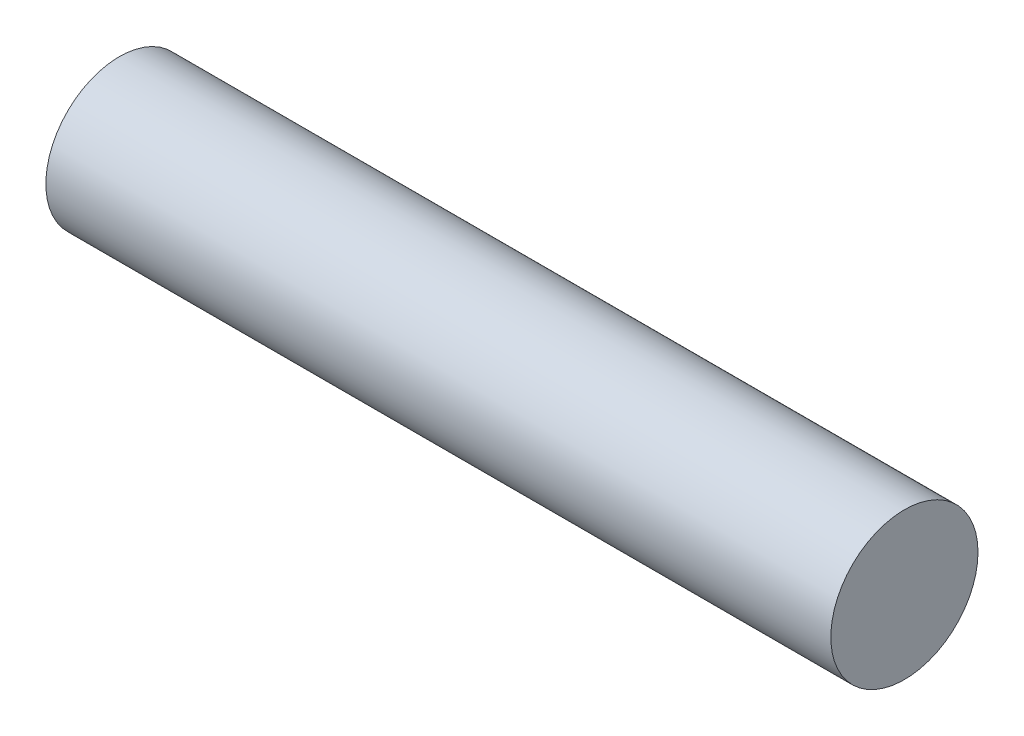
ISO-10303-21;
HEADER;
FILE_DESCRIPTION(('STEP AP214'),'2;1');
FILE_NAME('part.step','',(''),(''),'','','');
FILE_SCHEMA(('AUTOMOTIVE_DESIGN { 1 0 10303 214 1 1 1 1 }'));
ENDSEC;
DATA;
#1=APPLICATION_CONTEXT('core data for automotive mechanical design processes');
#2=APPLICATION_PROTOCOL_DEFINITION('international standard','automotive_design',2000,#1);
#3=PRODUCT_CONTEXT('',#1,'mechanical');
#4=PRODUCT('Part','Part','',(#3));
#5=PRODUCT_RELATED_PRODUCT_CATEGORY('part','',(#4));
#6=PRODUCT_DEFINITION_FORMATION('','',#4);
#7=PRODUCT_DEFINITION_CONTEXT('part definition',#1,'design');
#8=PRODUCT_DEFINITION('design','',#6,#7);
#9=PRODUCT_DEFINITION_SHAPE('','',#8);
#10=(LENGTH_UNIT() NAMED_UNIT(*) SI_UNIT(.MILLI.,.METRE.));
#11=(NAMED_UNIT(*) PLANE_ANGLE_UNIT() SI_UNIT($,.RADIAN.));
#12=(NAMED_UNIT(*) SI_UNIT($,.STERADIAN.) SOLID_ANGLE_UNIT());
#13=UNCERTAINTY_MEASURE_WITH_UNIT(LENGTH_MEASURE(1.E-05),#10,'distance_accuracy_value','');
#14=(GEOMETRIC_REPRESENTATION_CONTEXT(3) GLOBAL_UNCERTAINTY_ASSIGNED_CONTEXT((#13)) GLOBAL_UNIT_ASSIGNED_CONTEXT((#10,
#11,#12)) REPRESENTATION_CONTEXT('',''));
#15=CARTESIAN_POINT('',(0.,0.,0.));
#16=DIRECTION('',(0.,0.,1.));
#17=DIRECTION('',(1.,0.,0.));
#18=AXIS2_PLACEMENT_3D('',#15,#16,#17);
#19=CARTESIAN_POINT('',(160.,0.,0.));
#20=DIRECTION('',(-1.,0.,0.));
#21=DIRECTION('',(0.,0.,1.));
#22=AXIS2_PLACEMENT_3D('',#19,#20,#21);
#23=CYLINDRICAL_SURFACE('',#22,15.);
#24=CARTESIAN_POINT('',(160.,0.,0.));
#25=DIRECTION('',(1.,0.,0.));
#26=DIRECTION('',(0.,0.,-1.));
#27=AXIS2_PLACEMENT_3D('',#24,#25,#26);
#28=CIRCLE('',#27,15.);
#29=CARTESIAN_POINT('',(160.,0.,-15.));
#30=VERTEX_POINT('',#29);
#31=EDGE_CURVE('E10',#30,#30,#28,.T.);
#32=ORIENTED_EDGE('',*,*,#31,.F.);
#33=EDGE_LOOP('',(#32));
#34=FACE_BOUND('',#33,.T.);
#35=CARTESIAN_POINT('',(0.,0.,0.));
#36=DIRECTION('',(1.,0.,0.));
#37=DIRECTION('',(0.,0.,-1.));
#38=AXIS2_PLACEMENT_3D('',#35,#36,#37);
#39=CIRCLE('',#38,15.);
#40=CARTESIAN_POINT('',(0.,0.,-15.));
#41=VERTEX_POINT('',#40);
#42=EDGE_CURVE('E34',#41,#41,#39,.T.);
#43=ORIENTED_EDGE('',*,*,#42,.T.);
#44=EDGE_LOOP('',(#43));
#45=FACE_BOUND('',#44,.T.);
#46=ADVANCED_FACE('F31',(#34,#45),#23,.T.);
#47=CARTESIAN_POINT('',(160.,0.,0.));
#48=DIRECTION('',(1.,0.,0.));
#49=DIRECTION('',(0.,0.,-1.));
#50=AXIS2_PLACEMENT_3D('',#47,#48,#49);
#51=PLANE('',#50);
#52=ORIENTED_EDGE('',*,*,#31,.T.);
#53=EDGE_LOOP('',(#52));
#54=FACE_BOUND('',#53,.T.);
#55=ADVANCED_FACE('F46',(#54),#51,.T.);
#56=CARTESIAN_POINT('',(0.,0.,0.));
#57=DIRECTION('',(1.,0.,0.));
#58=DIRECTION('',(0.,0.,-1.));
#59=AXIS2_PLACEMENT_3D('',#56,#57,#58);
#60=PLANE('',#59);
#61=ORIENTED_EDGE('',*,*,#42,.F.);
#62=EDGE_LOOP('',(#61));
#63=FACE_BOUND('',#62,.T.);
#64=ADVANCED_FACE('F44',(#63),#60,.F.);
#65=CLOSED_SHELL('',(#46,#55,#64));
#66=MANIFOLD_SOLID_BREP('B2',#65);
#67=ADVANCED_BREP_SHAPE_REPRESENTATION('',(#18,#66),#14);
#68=SHAPE_DEFINITION_REPRESENTATION(#9,#67);
ENDSEC;
END-ISO-10303-21;
